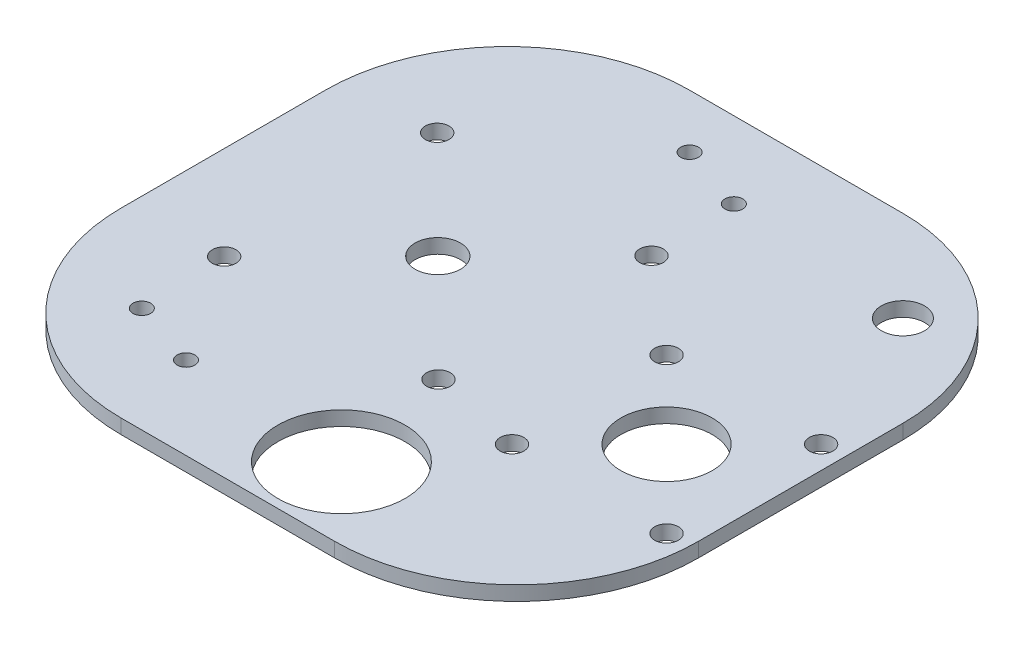
ISO-10303-21;
HEADER;
FILE_DESCRIPTION(('STEP AP214'),'2;1');
FILE_NAME('part.step','',(''),(''),'','','');
FILE_SCHEMA(('AUTOMOTIVE_DESIGN { 1 0 10303 214 1 1 1 1 }'));
ENDSEC;
DATA;
#1=APPLICATION_CONTEXT('core data for automotive mechanical design processes');
#2=APPLICATION_PROTOCOL_DEFINITION('international standard','automotive_design',2000,#1);
#3=PRODUCT_CONTEXT('',#1,'mechanical');
#4=PRODUCT('Part','Part','',(#3));
#5=PRODUCT_RELATED_PRODUCT_CATEGORY('part','',(#4));
#6=PRODUCT_DEFINITION_FORMATION('','',#4);
#7=PRODUCT_DEFINITION_CONTEXT('part definition',#1,'design');
#8=PRODUCT_DEFINITION('design','',#6,#7);
#9=PRODUCT_DEFINITION_SHAPE('','',#8);
#10=(LENGTH_UNIT() NAMED_UNIT(*) SI_UNIT(.MILLI.,.METRE.));
#11=(NAMED_UNIT(*) PLANE_ANGLE_UNIT() SI_UNIT($,.RADIAN.));
#12=(NAMED_UNIT(*) SI_UNIT($,.STERADIAN.) SOLID_ANGLE_UNIT());
#13=UNCERTAINTY_MEASURE_WITH_UNIT(LENGTH_MEASURE(1.E-05),#10,'distance_accuracy_value','');
#14=(GEOMETRIC_REPRESENTATION_CONTEXT(3) GLOBAL_UNCERTAINTY_ASSIGNED_CONTEXT((#13)) GLOBAL_UNIT_ASSIGNED_CONTEXT((#10,
#11,#12)) REPRESENTATION_CONTEXT('',''));
#15=CARTESIAN_POINT('',(0.,0.,0.));
#16=DIRECTION('',(0.,0.,1.));
#17=DIRECTION('',(1.,0.,0.));
#18=AXIS2_PLACEMENT_3D('',#15,#16,#17);
#19=CARTESIAN_POINT('',(22.,-3.175,55.));
#20=DIRECTION('',(1.,0.,0.));
#21=DIRECTION('',(0.,0.,-1.));
#22=AXIS2_PLACEMENT_3D('',#19,#20,#21);
#23=PLANE('',#22);
#24=DIRECTION('',(0.,0.,-1.));
#25=VECTOR('',#24,1.);
#26=CARTESIAN_POINT('',(22.,-3.175,55.));
#27=LINE('',#26,#25);
#28=CARTESIAN_POINT('',(22.,-3.175,15.));
#29=VERTEX_POINT('',#28);
#30=CARTESIAN_POINT('',(22.,-3.175,-30.));
#31=VERTEX_POINT('',#30);
#32=EDGE_CURVE('E171',#29,#31,#27,.T.);
#33=ORIENTED_EDGE('',*,*,#32,.T.);
#34=DIRECTION('',(0.,1.,0.));
#35=VECTOR('',#34,1.);
#36=CARTESIAN_POINT('',(22.,-3.175,-30.));
#37=LINE('',#36,#35);
#38=CARTESIAN_POINT('',(22.,0.,-30.));
#39=VERTEX_POINT('',#38);
#40=EDGE_CURVE('E125',#31,#39,#37,.T.);
#41=ORIENTED_EDGE('',*,*,#40,.T.);
#42=DIRECTION('',(0.,0.,-1.));
#43=VECTOR('',#42,1.);
#44=CARTESIAN_POINT('',(22.,0.,55.));
#45=LINE('',#44,#43);
#46=CARTESIAN_POINT('',(22.,0.,15.));
#47=VERTEX_POINT('',#46);
#48=EDGE_CURVE('E109',#47,#39,#45,.T.);
#49=ORIENTED_EDGE('',*,*,#48,.F.);
#50=DIRECTION('',(0.,1.,0.));
#51=VECTOR('',#50,1.);
#52=CARTESIAN_POINT('',(22.,-3.175,15.));
#53=LINE('',#52,#51);
#54=EDGE_CURVE('E122',#47,#29,#53,.F.);
#55=ORIENTED_EDGE('',*,*,#54,.T.);
#56=EDGE_LOOP('',(#33,#41,#49,#55));
#57=FACE_BOUND('',#56,.T.);
#58=ADVANCED_FACE('F41',(#57),#23,.T.);
#59=CARTESIAN_POINT('',(22.,-3.175,55.));
#60=DIRECTION('',(0.,0.,1.));
#61=DIRECTION('',(1.,0.,0.));
#62=AXIS2_PLACEMENT_3D('',#59,#60,#61);
#63=PLANE('',#62);
#64=DIRECTION('',(1.,0.,0.));
#65=VECTOR('',#64,1.);
#66=CARTESIAN_POINT('',(22.,-3.175,55.));
#67=LINE('',#66,#65);
#68=CARTESIAN_POINT('',(-65.,-3.175,55.));
#69=VERTEX_POINT('',#68);
#70=CARTESIAN_POINT('',(-18.,-3.175,55.));
#71=VERTEX_POINT('',#70);
#72=EDGE_CURVE('E132',#69,#71,#67,.T.);
#73=ORIENTED_EDGE('',*,*,#72,.T.);
#74=DIRECTION('',(0.,1.,0.));
#75=VECTOR('',#74,1.);
#76=CARTESIAN_POINT('',(-18.,-3.175,55.));
#77=LINE('',#76,#75);
#78=CARTESIAN_POINT('',(-18.,0.,55.));
#79=VERTEX_POINT('',#78);
#80=EDGE_CURVE('E158',#71,#79,#77,.T.);
#81=ORIENTED_EDGE('',*,*,#80,.T.);
#82=DIRECTION('',(1.,0.,0.));
#83=VECTOR('',#82,1.);
#84=CARTESIAN_POINT('',(22.,0.,55.));
#85=LINE('',#84,#83);
#86=CARTESIAN_POINT('',(-65.,0.,55.));
#87=VERTEX_POINT('',#86);
#88=EDGE_CURVE('E111',#87,#79,#85,.T.);
#89=ORIENTED_EDGE('',*,*,#88,.F.);
#90=DIRECTION('',(0.,1.,0.));
#91=VECTOR('',#90,1.);
#92=CARTESIAN_POINT('',(-65.,-3.175,55.));
#93=LINE('',#92,#91);
#94=EDGE_CURVE('E156',#87,#69,#93,.F.);
#95=ORIENTED_EDGE('',*,*,#94,.T.);
#96=EDGE_LOOP('',(#73,#81,#89,#95));
#97=FACE_BOUND('',#96,.T.);
#98=ADVANCED_FACE('F160',(#97),#63,.T.);
#99=CARTESIAN_POINT('',(-105.,-3.175,55.));
#100=DIRECTION('',(-1.,0.,0.));
#101=DIRECTION('',(0.,0.,1.));
#102=AXIS2_PLACEMENT_3D('',#99,#100,#101);
#103=PLANE('',#102);
#104=DIRECTION('',(0.,0.,1.));
#105=VECTOR('',#104,1.);
#106=CARTESIAN_POINT('',(-105.,-3.175,55.));
#107=LINE('',#106,#105);
#108=CARTESIAN_POINT('',(-105.,-3.175,-30.));
#109=VERTEX_POINT('',#108);
#110=CARTESIAN_POINT('',(-105.,-3.175,15.));
#111=VERTEX_POINT('',#110);
#112=EDGE_CURVE('E137',#109,#111,#107,.T.);
#113=ORIENTED_EDGE('',*,*,#112,.T.);
#114=DIRECTION('',(0.,1.,0.));
#115=VECTOR('',#114,1.);
#116=CARTESIAN_POINT('',(-105.,-3.175,15.));
#117=LINE('',#116,#115);
#118=CARTESIAN_POINT('',(-105.,0.,15.));
#119=VERTEX_POINT('',#118);
#120=EDGE_CURVE('E11',#111,#119,#117,.T.);
#121=ORIENTED_EDGE('',*,*,#120,.T.);
#122=DIRECTION('',(0.,0.,1.));
#123=VECTOR('',#122,1.);
#124=CARTESIAN_POINT('',(-105.,0.,55.));
#125=LINE('',#124,#123);
#126=CARTESIAN_POINT('',(-105.,0.,-30.));
#127=VERTEX_POINT('',#126);
#128=EDGE_CURVE('E169',#127,#119,#125,.T.);
#129=ORIENTED_EDGE('',*,*,#128,.F.);
#130=DIRECTION('',(0.,1.,0.));
#131=VECTOR('',#130,1.);
#132=CARTESIAN_POINT('',(-105.,-3.175,-30.));
#133=LINE('',#132,#131);
#134=EDGE_CURVE('E49',#127,#109,#133,.F.);
#135=ORIENTED_EDGE('',*,*,#134,.T.);
#136=EDGE_LOOP('',(#113,#121,#129,#135));
#137=FACE_BOUND('',#136,.T.);
#138=ADVANCED_FACE('F168',(#137),#103,.T.);
#139=CARTESIAN_POINT('',(22.,-3.175,-70.));
#140=DIRECTION('',(0.,0.,-1.));
#141=DIRECTION('',(-1.,0.,0.));
#142=AXIS2_PLACEMENT_3D('',#139,#140,#141);
#143=PLANE('',#142);
#144=DIRECTION('',(-1.,0.,0.));
#145=VECTOR('',#144,1.);
#146=CARTESIAN_POINT('',(22.,0.,-70.));
#147=LINE('',#146,#145);
#148=CARTESIAN_POINT('',(-18.,0.,-70.));
#149=VERTEX_POINT('',#148);
#150=CARTESIAN_POINT('',(-65.,0.,-70.));
#151=VERTEX_POINT('',#150);
#152=EDGE_CURVE('E126',#149,#151,#147,.T.);
#153=ORIENTED_EDGE('',*,*,#152,.F.);
#154=DIRECTION('',(0.,1.,0.));
#155=VECTOR('',#154,1.);
#156=CARTESIAN_POINT('',(-18.,-3.175,-70.));
#157=LINE('',#156,#155);
#158=CARTESIAN_POINT('',(-18.,-3.175,-70.));
#159=VERTEX_POINT('',#158);
#160=EDGE_CURVE('E148',#149,#159,#157,.F.);
#161=ORIENTED_EDGE('',*,*,#160,.T.);
#162=DIRECTION('',(-1.,0.,0.));
#163=VECTOR('',#162,1.);
#164=CARTESIAN_POINT('',(22.,-3.175,-70.));
#165=LINE('',#164,#163);
#166=CARTESIAN_POINT('',(-65.,-3.175,-70.));
#167=VERTEX_POINT('',#166);
#168=EDGE_CURVE('E175',#159,#167,#165,.T.);
#169=ORIENTED_EDGE('',*,*,#168,.T.);
#170=DIRECTION('',(0.,1.,0.));
#171=VECTOR('',#170,1.);
#172=CARTESIAN_POINT('',(-65.,-3.175,-70.));
#173=LINE('',#172,#171);
#174=EDGE_CURVE('E145',#167,#151,#173,.T.);
#175=ORIENTED_EDGE('',*,*,#174,.T.);
#176=EDGE_LOOP('',(#153,#161,#169,#175));
#177=FACE_BOUND('',#176,.T.);
#178=ADVANCED_FACE('F287',(#177),#143,.T.);
#179=CARTESIAN_POINT('',(0.,-3.175,0.));
#180=DIRECTION('',(0.,1.,0.));
#181=DIRECTION('',(0.,0.,1.));
#182=AXIS2_PLACEMENT_3D('',#179,#180,#181);
#183=PLANE('',#182);
#184=CARTESIAN_POINT('',(-83.6305944848585,-3.175,31.8170076872032));
#185=DIRECTION('',(0.,1.,0.));
#186=DIRECTION('',(0.,0.,1.));
#187=AXIS2_PLACEMENT_3D('',#184,#185,#186);
#188=CIRCLE('',#187,1.94999999999999);
#189=CARTESIAN_POINT('',(-83.6305944848585,-3.175,33.7670076872032));
#190=VERTEX_POINT('',#189);
#191=EDGE_CURVE('E268',#190,#190,#188,.T.);
#192=ORIENTED_EDGE('',*,*,#191,.T.);
#193=EDGE_LOOP('',(#192));
#194=FACE_BOUND('',#193,.T.);
#195=CARTESIAN_POINT('',(-68.9104387102413,-3.175,36.8102981825583));
#196=DIRECTION('',(0.,1.,0.));
#197=DIRECTION('',(0.,0.,1.));
#198=AXIS2_PLACEMENT_3D('',#195,#196,#197);
#199=CIRCLE('',#198,1.94999999999999);
#200=CARTESIAN_POINT('',(-68.9104387102413,-3.175,38.7602981825583));
#201=VERTEX_POINT('',#200);
#202=EDGE_CURVE('E262',#201,#201,#199,.T.);
#203=ORIENTED_EDGE('',*,*,#202,.T.);
#204=EDGE_LOOP('',(#203));
#205=FACE_BOUND('',#204,.T.);
#206=CARTESIAN_POINT('',(-38.3826738503544,-3.175,-53.1851576408656));
#207=DIRECTION('',(0.,1.,0.));
#208=DIRECTION('',(0.,0.,1.));
#209=AXIS2_PLACEMENT_3D('',#206,#207,#208);
#210=CIRCLE('',#209,1.94999999999999);
#211=CARTESIAN_POINT('',(-38.3826738503544,-3.175,-51.2351576408656));
#212=VERTEX_POINT('',#211);
#213=EDGE_CURVE('E256',#212,#212,#210,.T.);
#214=ORIENTED_EDGE('',*,*,#213,.T.);
#215=EDGE_LOOP('',(#214));
#216=FACE_BOUND('',#215,.T.);
#217=CARTESIAN_POINT('',(-53.102829624971,-3.175,-58.1784481362224));
#218=DIRECTION('',(0.,1.,0.));
#219=DIRECTION('',(0.,0.,1.));
#220=AXIS2_PLACEMENT_3D('',#217,#218,#219);
#221=CIRCLE('',#220,1.94999999999999);
#222=CARTESIAN_POINT('',(-53.102829624971,-3.175,-56.2284481362224));
#223=VERTEX_POINT('',#222);
#224=EDGE_CURVE('E250',#223,#223,#221,.T.);
#225=ORIENTED_EDGE('',*,*,#224,.T.);
#226=EDGE_LOOP('',(#225));
#227=FACE_BOUND('',#226,.T.);
#228=CARTESIAN_POINT('',(2.,-3.175,-50.));
#229=DIRECTION('',(0.,1.,0.));
#230=DIRECTION('',(0.,0.,1.));
#231=AXIS2_PLACEMENT_3D('',#228,#229,#230);
#232=CIRCLE('',#231,4.75);
#233=CARTESIAN_POINT('',(2.,-3.175,-45.25));
#234=VERTEX_POINT('',#233);
#235=EDGE_CURVE('E244',#234,#234,#232,.T.);
#236=ORIENTED_EDGE('',*,*,#235,.T.);
#237=EDGE_LOOP('',(#236));
#238=FACE_BOUND('',#237,.T.);
#239=CARTESIAN_POINT('',(-32.4250798959117,-3.175,39.0982031494063));
#240=DIRECTION('',(0.,1.,0.));
#241=DIRECTION('',(0.,0.,1.));
#242=AXIS2_PLACEMENT_3D('',#239,#240,#241);
#243=CIRCLE('',#242,14.);
#244=CARTESIAN_POINT('',(-32.4250798959117,-3.175,53.0982031494063));
#245=VERTEX_POINT('',#244);
#246=EDGE_CURVE('E236',#245,#245,#243,.T.);
#247=ORIENTED_EDGE('',*,*,#246,.T.);
#248=EDGE_LOOP('',(#247));
#249=FACE_BOUND('',#248,.T.);
#250=CARTESIAN_POINT('',(-61.0066341676062,-3.175,-10.684074976832));
#251=DIRECTION('',(0.,1.,0.));
#252=DIRECTION('',(0.,0.,1.));
#253=AXIS2_PLACEMENT_3D('',#250,#251,#252);
#254=CIRCLE('',#253,5.00000000000244);
#255=CARTESIAN_POINT('',(-61.0066341676062,-3.175,-5.68407497682959));
#256=VERTEX_POINT('',#255);
#257=EDGE_CURVE('E232',#256,#256,#254,.T.);
#258=ORIENTED_EDGE('',*,*,#257,.T.);
#259=EDGE_LOOP('',(#258));
#260=FACE_BOUND('',#259,.T.);
#261=CARTESIAN_POINT('',(-37.5786505232697,-3.175,-34.255871309753));
#262=DIRECTION('',(0.,1.,0.));
#263=DIRECTION('',(0.,0.,1.));
#264=AXIS2_PLACEMENT_3D('',#261,#262,#263);
#265=CIRCLE('',#264,2.59999999999999);
#266=CARTESIAN_POINT('',(-37.5786505232697,-3.175,-31.655871309753));
#267=VERTEX_POINT('',#266);
#268=EDGE_CURVE('E226',#267,#267,#265,.T.);
#269=ORIENTED_EDGE('',*,*,#268,.T.);
#270=EDGE_LOOP('',(#269));
#271=FACE_BOUND('',#270,.T.);
#272=CARTESIAN_POINT('',(-37.4348378346853,-3.175,12.7439086675044));
#273=DIRECTION('',(0.,1.,0.));
#274=DIRECTION('',(0.,0.,1.));
#275=AXIS2_PLACEMENT_3D('',#272,#273,#274);
#276=CIRCLE('',#275,2.59999999999999);
#277=CARTESIAN_POINT('',(-37.4348378346853,-3.175,15.3439086675044));
#278=VERTEX_POINT('',#277);
#279=EDGE_CURVE('E220',#278,#278,#276,.T.);
#280=ORIENTED_EDGE('',*,*,#279,.T.);
#281=EDGE_LOOP('',(#280));
#282=FACE_BOUND('',#281,.T.);
#283=CARTESIAN_POINT('',(-84.4346178119426,-3.175,12.8877213560889));
#284=DIRECTION('',(0.,1.,0.));
#285=DIRECTION('',(0.,0.,1.));
#286=AXIS2_PLACEMENT_3D('',#283,#284,#285);
#287=CIRCLE('',#286,2.6);
#288=CARTESIAN_POINT('',(-84.4346178119426,-3.175,15.4877213560889));
#289=VERTEX_POINT('',#288);
#290=EDGE_CURVE('E214',#289,#289,#287,.T.);
#291=ORIENTED_EDGE('',*,*,#290,.T.);
#292=EDGE_LOOP('',(#291));
#293=FACE_BOUND('',#292,.T.);
#294=CARTESIAN_POINT('',(-84.5784305005271,-3.175,-34.1120586211685));
#295=DIRECTION('',(0.,1.,0.));
#296=DIRECTION('',(0.,0.,1.));
#297=AXIS2_PLACEMENT_3D('',#294,#295,#296);
#298=CIRCLE('',#297,2.6);
#299=CARTESIAN_POINT('',(-84.5784305005271,-3.175,-31.5120586211685));
#300=VERTEX_POINT('',#299);
#301=EDGE_CURVE('E208',#300,#300,#298,.T.);
#302=ORIENTED_EDGE('',*,*,#301,.T.);
#303=EDGE_LOOP('',(#302));
#304=FACE_BOUND('',#303,.T.);
#305=CARTESIAN_POINT('',(17.,-3.175,-17.));
#306=DIRECTION('',(0.,1.,0.));
#307=DIRECTION('',(0.,0.,1.));
#308=AXIS2_PLACEMENT_3D('',#305,#306,#307);
#309=CIRCLE('',#308,2.6);
#310=CARTESIAN_POINT('',(17.,-3.175,-14.4));
#311=VERTEX_POINT('',#310);
#312=EDGE_CURVE('E202',#311,#311,#309,.T.);
#313=ORIENTED_EDGE('',*,*,#312,.T.);
#314=EDGE_LOOP('',(#313));
#315=FACE_BOUND('',#314,.T.);
#316=CARTESIAN_POINT('',(-17.,-3.175,-17.));
#317=DIRECTION('',(0.,1.,0.));
#318=DIRECTION('',(0.,0.,1.));
#319=AXIS2_PLACEMENT_3D('',#316,#317,#318);
#320=CIRCLE('',#319,2.6);
#321=CARTESIAN_POINT('',(-17.,-3.175,-14.4));
#322=VERTEX_POINT('',#321);
#323=EDGE_CURVE('E196',#322,#322,#320,.T.);
#324=ORIENTED_EDGE('',*,*,#323,.T.);
#325=EDGE_LOOP('',(#324));
#326=FACE_BOUND('',#325,.T.);
#327=CARTESIAN_POINT('',(-17.,-3.175,17.));
#328=DIRECTION('',(0.,1.,0.));
#329=DIRECTION('',(0.,0.,1.));
#330=AXIS2_PLACEMENT_3D('',#327,#328,#329);
#331=CIRCLE('',#330,2.6);
#332=CARTESIAN_POINT('',(-17.,-3.175,19.6));
#333=VERTEX_POINT('',#332);
#334=EDGE_CURVE('E190',#333,#333,#331,.T.);
#335=ORIENTED_EDGE('',*,*,#334,.T.);
#336=EDGE_LOOP('',(#335));
#337=FACE_BOUND('',#336,.T.);
#338=CARTESIAN_POINT('',(17.,-3.175,17.));
#339=DIRECTION('',(0.,1.,0.));
#340=DIRECTION('',(0.,0.,1.));
#341=AXIS2_PLACEMENT_3D('',#338,#339,#340);
#342=CIRCLE('',#341,2.6);
#343=CARTESIAN_POINT('',(17.,-3.175,19.6));
#344=VERTEX_POINT('',#343);
#345=EDGE_CURVE('E184',#344,#344,#342,.T.);
#346=ORIENTED_EDGE('',*,*,#345,.T.);
#347=EDGE_LOOP('',(#346));
#348=FACE_BOUND('',#347,.T.);
#349=CARTESIAN_POINT('',(0.,-3.175,0.));
#350=DIRECTION('',(0.,1.,0.));
#351=DIRECTION('',(0.,0.,1.));
#352=AXIS2_PLACEMENT_3D('',#349,#350,#351);
#353=CIRCLE('',#352,10.05);
#354=CARTESIAN_POINT('',(0.,-3.175,10.05));
#355=VERTEX_POINT('',#354);
#356=EDGE_CURVE('E127',#355,#355,#353,.T.);
#357=ORIENTED_EDGE('',*,*,#356,.T.);
#358=EDGE_LOOP('',(#357));
#359=FACE_BOUND('',#358,.T.);
#360=ORIENTED_EDGE('',*,*,#168,.F.);
#361=CARTESIAN_POINT('',(-18.,-3.175,-30.));
#362=DIRECTION('',(0.,1.,0.));
#363=DIRECTION('',(0.,0.,1.));
#364=AXIS2_PLACEMENT_3D('',#361,#362,#363);
#365=CIRCLE('',#364,40.);
#366=EDGE_CURVE('E154',#159,#31,#365,.F.);
#367=ORIENTED_EDGE('',*,*,#366,.T.);
#368=ORIENTED_EDGE('',*,*,#32,.F.);
#369=CARTESIAN_POINT('',(-18.,-3.175,15.));
#370=DIRECTION('',(0.,1.,0.));
#371=DIRECTION('',(0.,0.,1.));
#372=AXIS2_PLACEMENT_3D('',#369,#370,#371);
#373=CIRCLE('',#372,40.);
#374=EDGE_CURVE('E131',#29,#71,#373,.F.);
#375=ORIENTED_EDGE('',*,*,#374,.T.);
#376=ORIENTED_EDGE('',*,*,#72,.F.);
#377=CARTESIAN_POINT('',(-65.,-3.175,15.));
#378=DIRECTION('',(0.,1.,0.));
#379=DIRECTION('',(0.,0.,1.));
#380=AXIS2_PLACEMENT_3D('',#377,#378,#379);
#381=CIRCLE('',#380,40.);
#382=EDGE_CURVE('E56',#69,#111,#381,.F.);
#383=ORIENTED_EDGE('',*,*,#382,.T.);
#384=ORIENTED_EDGE('',*,*,#112,.F.);
#385=CARTESIAN_POINT('',(-65.,-3.175,-30.));
#386=DIRECTION('',(0.,1.,0.));
#387=DIRECTION('',(0.,0.,1.));
#388=AXIS2_PLACEMENT_3D('',#385,#386,#387);
#389=CIRCLE('',#388,40.);
#390=EDGE_CURVE('E150',#109,#167,#389,.F.);
#391=ORIENTED_EDGE('',*,*,#390,.T.);
#392=EDGE_LOOP('',(#360,#367,#368,#375,#376,#383,#384,#391));
#393=FACE_BOUND('',#392,.T.);
#394=ADVANCED_FACE('F163',(#194,#205,#216,#227,#238,#249,#260,#271,#282,#293,#304,#315,#326,
#337,#348,#359,#393),#183,.F.);
#395=CARTESIAN_POINT('',(0.,0.,0.));
#396=DIRECTION('',(0.,1.,0.));
#397=DIRECTION('',(0.,0.,1.));
#398=AXIS2_PLACEMENT_3D('',#395,#396,#397);
#399=PLANE('',#398);
#400=CARTESIAN_POINT('',(-83.6305944848585,0.,31.8170076872032));
#401=DIRECTION('',(0.,-1.,0.));
#402=DIRECTION('',(0.,0.,-1.));
#403=AXIS2_PLACEMENT_3D('',#400,#401,#402);
#404=CIRCLE('',#403,1.94999999999999);
#405=CARTESIAN_POINT('',(-83.6305944848585,0.,29.8670076872032));
#406=VERTEX_POINT('',#405);
#407=EDGE_CURVE('E271',#406,#406,#404,.T.);
#408=ORIENTED_EDGE('',*,*,#407,.T.);
#409=EDGE_LOOP('',(#408));
#410=FACE_BOUND('',#409,.T.);
#411=CARTESIAN_POINT('',(-68.9104387102413,0.,36.8102981825583));
#412=DIRECTION('',(0.,-1.,0.));
#413=DIRECTION('',(0.,0.,-1.));
#414=AXIS2_PLACEMENT_3D('',#411,#412,#413);
#415=CIRCLE('',#414,1.94999999999999);
#416=CARTESIAN_POINT('',(-68.9104387102413,0.,34.8602981825584));
#417=VERTEX_POINT('',#416);
#418=EDGE_CURVE('E265',#417,#417,#415,.T.);
#419=ORIENTED_EDGE('',*,*,#418,.T.);
#420=EDGE_LOOP('',(#419));
#421=FACE_BOUND('',#420,.T.);
#422=CARTESIAN_POINT('',(-38.3826738503544,0.,-53.1851576408656));
#423=DIRECTION('',(0.,-1.,0.));
#424=DIRECTION('',(0.,0.,-1.));
#425=AXIS2_PLACEMENT_3D('',#422,#423,#424);
#426=CIRCLE('',#425,1.95);
#427=CARTESIAN_POINT('',(-38.3826738503544,0.,-55.1351576408656));
#428=VERTEX_POINT('',#427);
#429=EDGE_CURVE('E259',#428,#428,#426,.T.);
#430=ORIENTED_EDGE('',*,*,#429,.T.);
#431=EDGE_LOOP('',(#430));
#432=FACE_BOUND('',#431,.T.);
#433=CARTESIAN_POINT('',(-53.102829624971,0.,-58.1784481362224));
#434=DIRECTION('',(0.,-1.,0.));
#435=DIRECTION('',(0.,0.,-1.));
#436=AXIS2_PLACEMENT_3D('',#433,#434,#435);
#437=CIRCLE('',#436,1.95);
#438=CARTESIAN_POINT('',(-53.102829624971,0.,-60.1284481362224));
#439=VERTEX_POINT('',#438);
#440=EDGE_CURVE('E253',#439,#439,#437,.T.);
#441=ORIENTED_EDGE('',*,*,#440,.T.);
#442=EDGE_LOOP('',(#441));
#443=FACE_BOUND('',#442,.T.);
#444=CARTESIAN_POINT('',(2.,0.,-50.));
#445=DIRECTION('',(0.,1.,0.));
#446=DIRECTION('',(0.,0.,1.));
#447=AXIS2_PLACEMENT_3D('',#444,#445,#446);
#448=CIRCLE('',#447,4.75);
#449=CARTESIAN_POINT('',(2.,0.,-45.25));
#450=VERTEX_POINT('',#449);
#451=EDGE_CURVE('E247',#450,#450,#448,.T.);
#452=ORIENTED_EDGE('',*,*,#451,.F.);
#453=EDGE_LOOP('',(#452));
#454=FACE_BOUND('',#453,.T.);
#455=CARTESIAN_POINT('',(-32.4250798959117,0.,39.0982031494063));
#456=DIRECTION('',(0.,1.,0.));
#457=DIRECTION('',(0.,0.,1.));
#458=AXIS2_PLACEMENT_3D('',#455,#456,#457);
#459=CIRCLE('',#458,14.);
#460=CARTESIAN_POINT('',(-32.4250798959117,0.,53.0982031494063));
#461=VERTEX_POINT('',#460);
#462=EDGE_CURVE('E241',#461,#461,#459,.T.);
#463=ORIENTED_EDGE('',*,*,#462,.F.);
#464=EDGE_LOOP('',(#463));
#465=FACE_BOUND('',#464,.T.);
#466=CARTESIAN_POINT('',(-61.0066341676062,0.,-10.684074976832));
#467=DIRECTION('',(0.,1.,0.));
#468=DIRECTION('',(0.,0.,1.));
#469=AXIS2_PLACEMENT_3D('',#466,#467,#468);
#470=CIRCLE('',#469,5.00000000000244);
#471=CARTESIAN_POINT('',(-61.0066341676062,0.,-5.68407497682959));
#472=VERTEX_POINT('',#471);
#473=EDGE_CURVE('E233',#472,#472,#470,.T.);
#474=ORIENTED_EDGE('',*,*,#473,.F.);
#475=EDGE_LOOP('',(#474));
#476=FACE_BOUND('',#475,.T.);
#477=CARTESIAN_POINT('',(-37.5786505232697,0.,-34.255871309753));
#478=DIRECTION('',(0.,1.,0.));
#479=DIRECTION('',(0.,0.,1.));
#480=AXIS2_PLACEMENT_3D('',#477,#478,#479);
#481=CIRCLE('',#480,2.59999999999998);
#482=CARTESIAN_POINT('',(-37.5786505232697,0.,-31.655871309753));
#483=VERTEX_POINT('',#482);
#484=EDGE_CURVE('E229',#483,#483,#481,.T.);
#485=ORIENTED_EDGE('',*,*,#484,.F.);
#486=EDGE_LOOP('',(#485));
#487=FACE_BOUND('',#486,.T.);
#488=CARTESIAN_POINT('',(-37.4348378346853,0.,12.7439086675044));
#489=DIRECTION('',(0.,1.,0.));
#490=DIRECTION('',(0.,0.,1.));
#491=AXIS2_PLACEMENT_3D('',#488,#489,#490);
#492=CIRCLE('',#491,2.59999999999998);
#493=CARTESIAN_POINT('',(-37.4348378346853,0.,15.3439086675044));
#494=VERTEX_POINT('',#493);
#495=EDGE_CURVE('E223',#494,#494,#492,.T.);
#496=ORIENTED_EDGE('',*,*,#495,.F.);
#497=EDGE_LOOP('',(#496));
#498=FACE_BOUND('',#497,.T.);
#499=CARTESIAN_POINT('',(-84.4346178119426,0.,12.8877213560889));
#500=DIRECTION('',(0.,1.,0.));
#501=DIRECTION('',(0.,0.,1.));
#502=AXIS2_PLACEMENT_3D('',#499,#500,#501);
#503=CIRCLE('',#502,2.59999999999999);
#504=CARTESIAN_POINT('',(-84.4346178119426,0.,15.4877213560889));
#505=VERTEX_POINT('',#504);
#506=EDGE_CURVE('E217',#505,#505,#503,.T.);
#507=ORIENTED_EDGE('',*,*,#506,.F.);
#508=EDGE_LOOP('',(#507));
#509=FACE_BOUND('',#508,.T.);
#510=CARTESIAN_POINT('',(-84.5784305005271,0.,-34.1120586211685));
#511=DIRECTION('',(0.,1.,0.));
#512=DIRECTION('',(0.,0.,1.));
#513=AXIS2_PLACEMENT_3D('',#510,#511,#512);
#514=CIRCLE('',#513,2.59999999999999);
#515=CARTESIAN_POINT('',(-84.5784305005271,0.,-31.5120586211685));
#516=VERTEX_POINT('',#515);
#517=EDGE_CURVE('E211',#516,#516,#514,.T.);
#518=ORIENTED_EDGE('',*,*,#517,.F.);
#519=EDGE_LOOP('',(#518));
#520=FACE_BOUND('',#519,.T.);
#521=CARTESIAN_POINT('',(17.,0.,-17.));
#522=DIRECTION('',(0.,1.,0.));
#523=DIRECTION('',(0.,0.,1.));
#524=AXIS2_PLACEMENT_3D('',#521,#522,#523);
#525=CIRCLE('',#524,2.6);
#526=CARTESIAN_POINT('',(17.,0.,-14.4));
#527=VERTEX_POINT('',#526);
#528=EDGE_CURVE('E205',#527,#527,#525,.T.);
#529=ORIENTED_EDGE('',*,*,#528,.F.);
#530=EDGE_LOOP('',(#529));
#531=FACE_BOUND('',#530,.T.);
#532=CARTESIAN_POINT('',(-17.,0.,-17.));
#533=DIRECTION('',(0.,1.,0.));
#534=DIRECTION('',(0.,0.,1.));
#535=AXIS2_PLACEMENT_3D('',#532,#533,#534);
#536=CIRCLE('',#535,2.6);
#537=CARTESIAN_POINT('',(-17.,0.,-14.4));
#538=VERTEX_POINT('',#537);
#539=EDGE_CURVE('E199',#538,#538,#536,.T.);
#540=ORIENTED_EDGE('',*,*,#539,.F.);
#541=EDGE_LOOP('',(#540));
#542=FACE_BOUND('',#541,.T.);
#543=CARTESIAN_POINT('',(-17.,0.,17.));
#544=DIRECTION('',(0.,1.,0.));
#545=DIRECTION('',(0.,0.,1.));
#546=AXIS2_PLACEMENT_3D('',#543,#544,#545);
#547=CIRCLE('',#546,2.6);
#548=CARTESIAN_POINT('',(-17.,0.,19.6));
#549=VERTEX_POINT('',#548);
#550=EDGE_CURVE('E193',#549,#549,#547,.T.);
#551=ORIENTED_EDGE('',*,*,#550,.F.);
#552=EDGE_LOOP('',(#551));
#553=FACE_BOUND('',#552,.T.);
#554=CARTESIAN_POINT('',(17.,0.,17.));
#555=DIRECTION('',(0.,1.,0.));
#556=DIRECTION('',(0.,0.,1.));
#557=AXIS2_PLACEMENT_3D('',#554,#555,#556);
#558=CIRCLE('',#557,2.6);
#559=CARTESIAN_POINT('',(17.,0.,19.6));
#560=VERTEX_POINT('',#559);
#561=EDGE_CURVE('E187',#560,#560,#558,.T.);
#562=ORIENTED_EDGE('',*,*,#561,.F.);
#563=EDGE_LOOP('',(#562));
#564=FACE_BOUND('',#563,.T.);
#565=CARTESIAN_POINT('',(0.,0.,0.));
#566=DIRECTION('',(0.,1.,0.));
#567=DIRECTION('',(0.,0.,1.));
#568=AXIS2_PLACEMENT_3D('',#565,#566,#567);
#569=CIRCLE('',#568,10.05);
#570=CARTESIAN_POINT('',(0.,0.,10.05));
#571=VERTEX_POINT('',#570);
#572=EDGE_CURVE('E181',#571,#571,#569,.T.);
#573=ORIENTED_EDGE('',*,*,#572,.F.);
#574=EDGE_LOOP('',(#573));
#575=FACE_BOUND('',#574,.T.);
#576=ORIENTED_EDGE('',*,*,#48,.T.);
#577=CARTESIAN_POINT('',(-18.,0.,-30.));
#578=DIRECTION('',(0.,1.,0.));
#579=DIRECTION('',(0.,0.,1.));
#580=AXIS2_PLACEMENT_3D('',#577,#578,#579);
#581=CIRCLE('',#580,40.);
#582=EDGE_CURVE('E116',#39,#149,#581,.T.);
#583=ORIENTED_EDGE('',*,*,#582,.T.);
#584=ORIENTED_EDGE('',*,*,#152,.T.);
#585=CARTESIAN_POINT('',(-65.,0.,-30.));
#586=DIRECTION('',(0.,1.,0.));
#587=DIRECTION('',(0.,0.,1.));
#588=AXIS2_PLACEMENT_3D('',#585,#586,#587);
#589=CIRCLE('',#588,40.);
#590=EDGE_CURVE('E134',#151,#127,#589,.T.);
#591=ORIENTED_EDGE('',*,*,#590,.T.);
#592=ORIENTED_EDGE('',*,*,#128,.T.);
#593=CARTESIAN_POINT('',(-65.,0.,15.));
#594=DIRECTION('',(0.,1.,0.));
#595=DIRECTION('',(0.,0.,1.));
#596=AXIS2_PLACEMENT_3D('',#593,#594,#595);
#597=CIRCLE('',#596,40.);
#598=EDGE_CURVE('E117',#119,#87,#597,.T.);
#599=ORIENTED_EDGE('',*,*,#598,.T.);
#600=ORIENTED_EDGE('',*,*,#88,.T.);
#601=CARTESIAN_POINT('',(-18.,0.,15.));
#602=DIRECTION('',(0.,1.,0.));
#603=DIRECTION('',(0.,0.,1.));
#604=AXIS2_PLACEMENT_3D('',#601,#602,#603);
#605=CIRCLE('',#604,40.);
#606=EDGE_CURVE('E107',#79,#47,#605,.T.);
#607=ORIENTED_EDGE('',*,*,#606,.T.);
#608=EDGE_LOOP('',(#576,#583,#584,#591,#592,#599,#600,#607));
#609=FACE_BOUND('',#608,.T.);
#610=ADVANCED_FACE('F43',(#410,#421,#432,#443,#454,#465,#476,#487,#498,#509,#520,#531,#542,#553,
#564,#575,#609),#399,.T.);
#611=CARTESIAN_POINT('',(0.,-10.,0.));
#612=DIRECTION('',(0.,1.,0.));
#613=DIRECTION('',(0.,0.,1.));
#614=AXIS2_PLACEMENT_3D('',#611,#612,#613);
#615=CYLINDRICAL_SURFACE('',#614,10.05);
#616=ORIENTED_EDGE('',*,*,#572,.T.);
#617=EDGE_LOOP('',(#616));
#618=FACE_BOUND('',#617,.T.);
#619=ORIENTED_EDGE('',*,*,#356,.F.);
#620=EDGE_LOOP('',(#619));
#621=FACE_BOUND('',#620,.T.);
#622=ADVANCED_FACE('F319',(#618,#621),#615,.F.);
#623=CARTESIAN_POINT('',(17.,0.,17.));
#624=DIRECTION('',(0.,1.,0.));
#625=DIRECTION('',(0.,0.,1.));
#626=AXIS2_PLACEMENT_3D('',#623,#624,#625);
#627=CYLINDRICAL_SURFACE('',#626,2.6);
#628=ORIENTED_EDGE('',*,*,#345,.F.);
#629=EDGE_LOOP('',(#628));
#630=FACE_BOUND('',#629,.T.);
#631=ORIENTED_EDGE('',*,*,#561,.T.);
#632=EDGE_LOOP('',(#631));
#633=FACE_BOUND('',#632,.T.);
#634=ADVANCED_FACE('F321',(#630,#633),#627,.F.);
#635=CARTESIAN_POINT('',(-17.,0.,17.));
#636=DIRECTION('',(0.,1.,0.));
#637=DIRECTION('',(0.,0.,1.));
#638=AXIS2_PLACEMENT_3D('',#635,#636,#637);
#639=CYLINDRICAL_SURFACE('',#638,2.6);
#640=ORIENTED_EDGE('',*,*,#334,.F.);
#641=EDGE_LOOP('',(#640));
#642=FACE_BOUND('',#641,.T.);
#643=ORIENTED_EDGE('',*,*,#550,.T.);
#644=EDGE_LOOP('',(#643));
#645=FACE_BOUND('',#644,.T.);
#646=ADVANCED_FACE('F328',(#642,#645),#639,.F.);
#647=CARTESIAN_POINT('',(-17.,0.,-17.));
#648=DIRECTION('',(0.,1.,0.));
#649=DIRECTION('',(0.,0.,1.));
#650=AXIS2_PLACEMENT_3D('',#647,#648,#649);
#651=CYLINDRICAL_SURFACE('',#650,2.6);
#652=ORIENTED_EDGE('',*,*,#323,.F.);
#653=EDGE_LOOP('',(#652));
#654=FACE_BOUND('',#653,.T.);
#655=ORIENTED_EDGE('',*,*,#539,.T.);
#656=EDGE_LOOP('',(#655));
#657=FACE_BOUND('',#656,.T.);
#658=ADVANCED_FACE('F507',(#654,#657),#651,.F.);
#659=CARTESIAN_POINT('',(17.,0.,-17.));
#660=DIRECTION('',(0.,1.,0.));
#661=DIRECTION('',(0.,0.,1.));
#662=AXIS2_PLACEMENT_3D('',#659,#660,#661);
#663=CYLINDRICAL_SURFACE('',#662,2.6);
#664=ORIENTED_EDGE('',*,*,#312,.F.);
#665=EDGE_LOOP('',(#664));
#666=FACE_BOUND('',#665,.T.);
#667=ORIENTED_EDGE('',*,*,#528,.T.);
#668=EDGE_LOOP('',(#667));
#669=FACE_BOUND('',#668,.T.);
#670=ADVANCED_FACE('F517',(#666,#669),#663,.F.);
#671=CARTESIAN_POINT('',(-84.5784305005271,0.,-34.1120586211685));
#672=DIRECTION('',(0.,1.,0.));
#673=DIRECTION('',(0.,0.,1.));
#674=AXIS2_PLACEMENT_3D('',#671,#672,#673);
#675=CYLINDRICAL_SURFACE('',#674,2.6);
#676=ORIENTED_EDGE('',*,*,#301,.F.);
#677=EDGE_LOOP('',(#676));
#678=FACE_BOUND('',#677,.T.);
#679=ORIENTED_EDGE('',*,*,#517,.T.);
#680=EDGE_LOOP('',(#679));
#681=FACE_BOUND('',#680,.T.);
#682=ADVANCED_FACE('F527',(#678,#681),#675,.F.);
#683=CARTESIAN_POINT('',(-84.4346178119426,0.,12.8877213560889));
#684=DIRECTION('',(0.,1.,0.));
#685=DIRECTION('',(0.,0.,1.));
#686=AXIS2_PLACEMENT_3D('',#683,#684,#685);
#687=CYLINDRICAL_SURFACE('',#686,2.6);
#688=ORIENTED_EDGE('',*,*,#290,.F.);
#689=EDGE_LOOP('',(#688));
#690=FACE_BOUND('',#689,.T.);
#691=ORIENTED_EDGE('',*,*,#506,.T.);
#692=EDGE_LOOP('',(#691));
#693=FACE_BOUND('',#692,.T.);
#694=ADVANCED_FACE('F537',(#690,#693),#687,.F.);
#695=CARTESIAN_POINT('',(-37.4348378346853,0.,12.7439086675044));
#696=DIRECTION('',(0.,1.,0.));
#697=DIRECTION('',(0.,0.,1.));
#698=AXIS2_PLACEMENT_3D('',#695,#696,#697);
#699=CYLINDRICAL_SURFACE('',#698,2.59999999999999);
#700=ORIENTED_EDGE('',*,*,#279,.F.);
#701=EDGE_LOOP('',(#700));
#702=FACE_BOUND('',#701,.T.);
#703=ORIENTED_EDGE('',*,*,#495,.T.);
#704=EDGE_LOOP('',(#703));
#705=FACE_BOUND('',#704,.T.);
#706=ADVANCED_FACE('F547',(#702,#705),#699,.F.);
#707=CARTESIAN_POINT('',(-37.5786505232697,0.,-34.255871309753));
#708=DIRECTION('',(0.,1.,0.));
#709=DIRECTION('',(0.,0.,1.));
#710=AXIS2_PLACEMENT_3D('',#707,#708,#709);
#711=CYLINDRICAL_SURFACE('',#710,2.59999999999999);
#712=ORIENTED_EDGE('',*,*,#268,.F.);
#713=EDGE_LOOP('',(#712));
#714=FACE_BOUND('',#713,.T.);
#715=ORIENTED_EDGE('',*,*,#484,.T.);
#716=EDGE_LOOP('',(#715));
#717=FACE_BOUND('',#716,.T.);
#718=ADVANCED_FACE('F408',(#714,#717),#711,.F.);
#719=CARTESIAN_POINT('',(-61.0066341676062,-3.175,-10.684074976832));
#720=DIRECTION('',(0.,1.,0.));
#721=DIRECTION('',(0.,0.,1.));
#722=AXIS2_PLACEMENT_3D('',#719,#720,#721);
#723=CYLINDRICAL_SURFACE('',#722,5.00000000000244);
#724=ORIENTED_EDGE('',*,*,#257,.F.);
#725=EDGE_LOOP('',(#724));
#726=FACE_BOUND('',#725,.T.);
#727=ORIENTED_EDGE('',*,*,#473,.T.);
#728=EDGE_LOOP('',(#727));
#729=FACE_BOUND('',#728,.T.);
#730=ADVANCED_FACE('F402',(#726,#729),#723,.F.);
#731=CARTESIAN_POINT('',(-32.4250798959117,-10.,39.0982031494063));
#732=DIRECTION('',(0.,1.,0.));
#733=DIRECTION('',(0.,0.,1.));
#734=AXIS2_PLACEMENT_3D('',#731,#732,#733);
#735=CYLINDRICAL_SURFACE('',#734,14.);
#736=ORIENTED_EDGE('',*,*,#462,.T.);
#737=EDGE_LOOP('',(#736));
#738=FACE_BOUND('',#737,.T.);
#739=ORIENTED_EDGE('',*,*,#246,.F.);
#740=EDGE_LOOP('',(#739));
#741=FACE_BOUND('',#740,.T.);
#742=ADVANCED_FACE('F407',(#738,#741),#735,.F.);
#743=CARTESIAN_POINT('',(2.,-10.,-50.));
#744=DIRECTION('',(0.,1.,0.));
#745=DIRECTION('',(0.,0.,1.));
#746=AXIS2_PLACEMENT_3D('',#743,#744,#745);
#747=CYLINDRICAL_SURFACE('',#746,4.75);
#748=ORIENTED_EDGE('',*,*,#451,.T.);
#749=EDGE_LOOP('',(#748));
#750=FACE_BOUND('',#749,.T.);
#751=ORIENTED_EDGE('',*,*,#235,.F.);
#752=EDGE_LOOP('',(#751));
#753=FACE_BOUND('',#752,.T.);
#754=ADVANCED_FACE('F419',(#750,#753),#747,.F.);
#755=CARTESIAN_POINT('',(-53.102829624971,-6.28799999999999,-58.1784481362224));
#756=DIRECTION('',(0.,-1.,0.));
#757=DIRECTION('',(0.,0.,-1.));
#758=AXIS2_PLACEMENT_3D('',#755,#756,#757);
#759=CYLINDRICAL_SURFACE('',#758,1.94999999999999);
#760=ORIENTED_EDGE('',*,*,#440,.F.);
#761=EDGE_LOOP('',(#760));
#762=FACE_BOUND('',#761,.T.);
#763=ORIENTED_EDGE('',*,*,#224,.F.);
#764=EDGE_LOOP('',(#763));
#765=FACE_BOUND('',#764,.T.);
#766=ADVANCED_FACE('F428',(#762,#765),#759,.F.);
#767=CARTESIAN_POINT('',(-38.3826738503544,-6.28799999999999,-53.1851576408656));
#768=DIRECTION('',(0.,-1.,0.));
#769=DIRECTION('',(0.,0.,-1.));
#770=AXIS2_PLACEMENT_3D('',#767,#768,#769);
#771=CYLINDRICAL_SURFACE('',#770,1.94999999999999);
#772=ORIENTED_EDGE('',*,*,#429,.F.);
#773=EDGE_LOOP('',(#772));
#774=FACE_BOUND('',#773,.T.);
#775=ORIENTED_EDGE('',*,*,#213,.F.);
#776=EDGE_LOOP('',(#775));
#777=FACE_BOUND('',#776,.T.);
#778=ADVANCED_FACE('F441',(#774,#777),#771,.F.);
#779=CARTESIAN_POINT('',(-68.9104387102413,-6.28799999999999,36.8102981825583));
#780=DIRECTION('',(0.,-1.,0.));
#781=DIRECTION('',(0.,0.,-1.));
#782=AXIS2_PLACEMENT_3D('',#779,#780,#781);
#783=CYLINDRICAL_SURFACE('',#782,1.94999999999999);
#784=ORIENTED_EDGE('',*,*,#418,.F.);
#785=EDGE_LOOP('',(#784));
#786=FACE_BOUND('',#785,.T.);
#787=ORIENTED_EDGE('',*,*,#202,.F.);
#788=EDGE_LOOP('',(#787));
#789=FACE_BOUND('',#788,.T.);
#790=ADVANCED_FACE('F281',(#786,#789),#783,.F.);
#791=CARTESIAN_POINT('',(-83.6305944848585,-6.28799999999999,31.8170076872032));
#792=DIRECTION('',(0.,-1.,0.));
#793=DIRECTION('',(0.,0.,-1.));
#794=AXIS2_PLACEMENT_3D('',#791,#792,#793);
#795=CYLINDRICAL_SURFACE('',#794,1.94999999999999);
#796=ORIENTED_EDGE('',*,*,#407,.F.);
#797=EDGE_LOOP('',(#796));
#798=FACE_BOUND('',#797,.T.);
#799=ORIENTED_EDGE('',*,*,#191,.F.);
#800=EDGE_LOOP('',(#799));
#801=FACE_BOUND('',#800,.T.);
#802=ADVANCED_FACE('F277',(#798,#801),#795,.F.);
#803=CARTESIAN_POINT('',(-18.,-3.175,-30.));
#804=DIRECTION('',(0.,1.,0.));
#805=DIRECTION('',(0.,0.,1.));
#806=AXIS2_PLACEMENT_3D('',#803,#804,#805);
#807=CYLINDRICAL_SURFACE('',#806,40.);
#808=ORIENTED_EDGE('',*,*,#366,.F.);
#809=ORIENTED_EDGE('',*,*,#160,.F.);
#810=ORIENTED_EDGE('',*,*,#582,.F.);
#811=ORIENTED_EDGE('',*,*,#40,.F.);
#812=EDGE_LOOP('',(#808,#809,#810,#811));
#813=FACE_BOUND('',#812,.T.);
#814=ADVANCED_FACE('F280',(#813),#807,.T.);
#815=CARTESIAN_POINT('',(-18.,-3.175,15.));
#816=DIRECTION('',(0.,1.,0.));
#817=DIRECTION('',(0.,0.,1.));
#818=AXIS2_PLACEMENT_3D('',#815,#816,#817);
#819=CYLINDRICAL_SURFACE('',#818,40.);
#820=ORIENTED_EDGE('',*,*,#374,.F.);
#821=ORIENTED_EDGE('',*,*,#54,.F.);
#822=ORIENTED_EDGE('',*,*,#606,.F.);
#823=ORIENTED_EDGE('',*,*,#80,.F.);
#824=EDGE_LOOP('',(#820,#821,#822,#823));
#825=FACE_BOUND('',#824,.T.);
#826=ADVANCED_FACE('F130',(#825),#819,.T.);
#827=CARTESIAN_POINT('',(-65.,-3.175,15.));
#828=DIRECTION('',(0.,1.,0.));
#829=DIRECTION('',(0.,0.,1.));
#830=AXIS2_PLACEMENT_3D('',#827,#828,#829);
#831=CYLINDRICAL_SURFACE('',#830,40.);
#832=ORIENTED_EDGE('',*,*,#382,.F.);
#833=ORIENTED_EDGE('',*,*,#94,.F.);
#834=ORIENTED_EDGE('',*,*,#598,.F.);
#835=ORIENTED_EDGE('',*,*,#120,.F.);
#836=EDGE_LOOP('',(#832,#833,#834,#835));
#837=FACE_BOUND('',#836,.T.);
#838=ADVANCED_FACE('F166',(#837),#831,.T.);
#839=CARTESIAN_POINT('',(-65.,-3.175,-30.));
#840=DIRECTION('',(0.,1.,0.));
#841=DIRECTION('',(0.,0.,1.));
#842=AXIS2_PLACEMENT_3D('',#839,#840,#841);
#843=CYLINDRICAL_SURFACE('',#842,40.);
#844=ORIENTED_EDGE('',*,*,#390,.F.);
#845=ORIENTED_EDGE('',*,*,#134,.F.);
#846=ORIENTED_EDGE('',*,*,#590,.F.);
#847=ORIENTED_EDGE('',*,*,#174,.F.);
#848=EDGE_LOOP('',(#844,#845,#846,#847));
#849=FACE_BOUND('',#848,.T.);
#850=ADVANCED_FACE('F346',(#849),#843,.T.);
#851=CLOSED_SHELL('',(#58,#98,#138,#178,#394,#610,#622,#634,#646,#658,#670,#682,#694,#706,#718,
#730,#742,#754,#766,#778,#790,#802,#814,#826,#838,#850));
#852=MANIFOLD_SOLID_BREP('B2',#851);
#853=ADVANCED_BREP_SHAPE_REPRESENTATION('',(#18,#852),#14);
#854=SHAPE_DEFINITION_REPRESENTATION(#9,#853);
ENDSEC;
END-ISO-10303-21;
